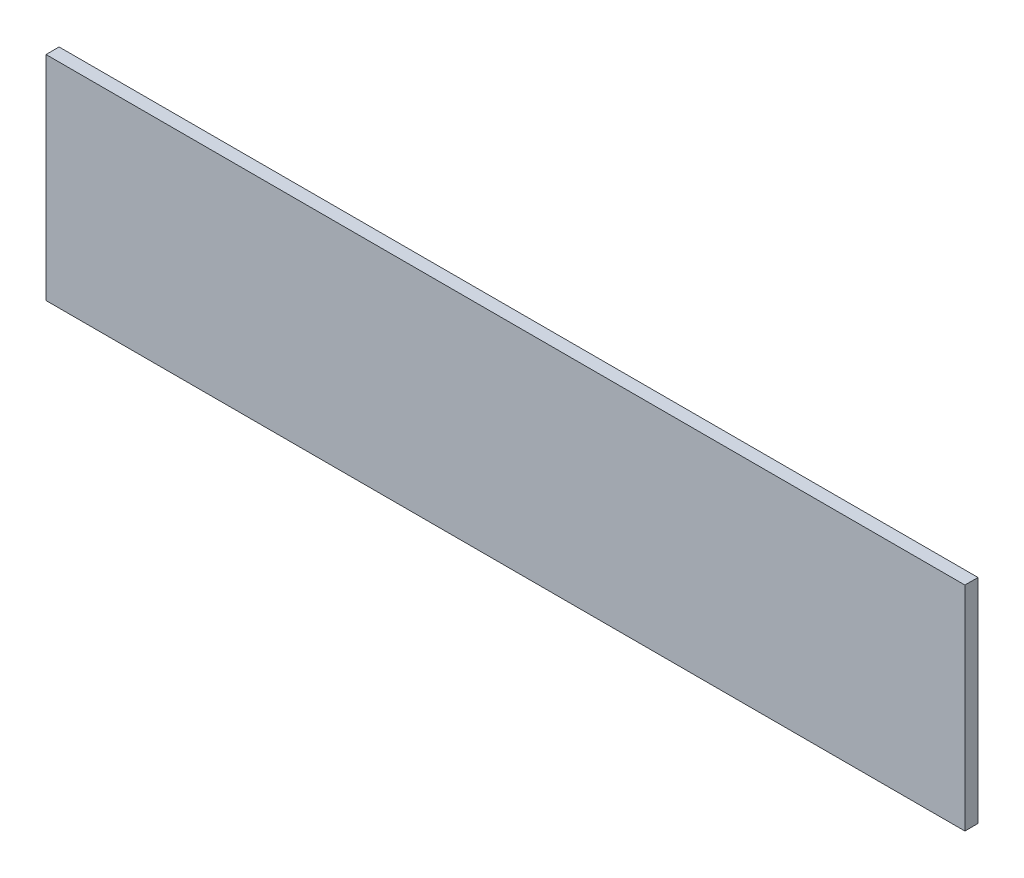
ISO-10303-21;
HEADER;
FILE_DESCRIPTION(('STEP AP214'),'2;1');
FILE_NAME('part.step','',(''),(''),'','','');
FILE_SCHEMA(('AUTOMOTIVE_DESIGN { 1 0 10303 214 1 1 1 1 }'));
ENDSEC;
DATA;
#1=APPLICATION_CONTEXT('core data for automotive mechanical design processes');
#2=APPLICATION_PROTOCOL_DEFINITION('international standard','automotive_design',2000,#1);
#3=PRODUCT_CONTEXT('',#1,'mechanical');
#4=PRODUCT('Part','Part','',(#3));
#5=PRODUCT_RELATED_PRODUCT_CATEGORY('part','',(#4));
#6=PRODUCT_DEFINITION_FORMATION('','',#4);
#7=PRODUCT_DEFINITION_CONTEXT('part definition',#1,'design');
#8=PRODUCT_DEFINITION('design','',#6,#7);
#9=PRODUCT_DEFINITION_SHAPE('','',#8);
#10=(LENGTH_UNIT() NAMED_UNIT(*) SI_UNIT(.MILLI.,.METRE.));
#11=(NAMED_UNIT(*) PLANE_ANGLE_UNIT() SI_UNIT($,.RADIAN.));
#12=(NAMED_UNIT(*) SI_UNIT($,.STERADIAN.) SOLID_ANGLE_UNIT());
#13=UNCERTAINTY_MEASURE_WITH_UNIT(LENGTH_MEASURE(1.E-05),#10,'distance_accuracy_value','');
#14=(GEOMETRIC_REPRESENTATION_CONTEXT(3) GLOBAL_UNCERTAINTY_ASSIGNED_CONTEXT((#13)) GLOBAL_UNIT_ASSIGNED_CONTEXT((#10,
#11,#12)) REPRESENTATION_CONTEXT('',''));
#15=CARTESIAN_POINT('',(0.,0.,0.));
#16=DIRECTION('',(0.,0.,1.));
#17=DIRECTION('',(1.,0.,0.));
#18=AXIS2_PLACEMENT_3D('',#15,#16,#17);
#19=CARTESIAN_POINT('',(-227.6475,72.469375,3.1242));
#20=DIRECTION('',(1.,0.,0.));
#21=DIRECTION('',(0.,0.,-1.));
#22=AXIS2_PLACEMENT_3D('',#19,#20,#21);
#23=PLANE('',#22);
#24=DIRECTION('',(0.,-1.,0.));
#25=VECTOR('',#24,1.);
#26=CARTESIAN_POINT('',(-227.6475,72.469375,0.));
#27=LINE('',#26,#25);
#28=CARTESIAN_POINT('',(-227.6475,72.469375,0.));
#29=VERTEX_POINT('',#28);
#30=CARTESIAN_POINT('',(-227.6475,21.669375,0.));
#31=VERTEX_POINT('',#30);
#32=EDGE_CURVE('E98',#29,#31,#27,.T.);
#33=ORIENTED_EDGE('',*,*,#32,.T.);
#34=DIRECTION('',(0.,0.,-1.));
#35=VECTOR('',#34,1.);
#36=CARTESIAN_POINT('',(-227.6475,21.669375,3.1242));
#37=LINE('',#36,#35);
#38=CARTESIAN_POINT('',(-227.6475,21.669375,3.1242));
#39=VERTEX_POINT('',#38);
#40=EDGE_CURVE('E11',#39,#31,#37,.T.);
#41=ORIENTED_EDGE('',*,*,#40,.F.);
#42=DIRECTION('',(0.,-1.,0.));
#43=VECTOR('',#42,1.);
#44=CARTESIAN_POINT('',(-227.6475,72.469375,3.1242));
#45=LINE('',#44,#43);
#46=CARTESIAN_POINT('',(-227.6475,72.469375,3.1242));
#47=VERTEX_POINT('',#46);
#48=EDGE_CURVE('E86',#47,#39,#45,.T.);
#49=ORIENTED_EDGE('',*,*,#48,.F.);
#50=DIRECTION('',(0.,0.,-1.));
#51=VECTOR('',#50,1.);
#52=CARTESIAN_POINT('',(-227.6475,72.469375,3.1242));
#53=LINE('',#52,#51);
#54=EDGE_CURVE('E94',#47,#29,#53,.T.);
#55=ORIENTED_EDGE('',*,*,#54,.T.);
#56=EDGE_LOOP('',(#33,#41,#49,#55));
#57=FACE_BOUND('',#56,.T.);
#58=ADVANCED_FACE('F35',(#57),#23,.F.);
#59=CARTESIAN_POINT('',(-227.6475,21.669375,3.1242));
#60=DIRECTION('',(0.,1.,0.));
#61=DIRECTION('',(0.,0.,1.));
#62=AXIS2_PLACEMENT_3D('',#59,#60,#61);
#63=PLANE('',#62);
#64=DIRECTION('',(1.,0.,0.));
#65=VECTOR('',#64,1.);
#66=CARTESIAN_POINT('',(-227.6475,21.669375,0.));
#67=LINE('',#66,#65);
#68=CARTESIAN_POINT('',(-8.57249999999987,21.669375,0.));
#69=VERTEX_POINT('',#68);
#70=EDGE_CURVE('E90',#31,#69,#67,.T.);
#71=ORIENTED_EDGE('',*,*,#70,.T.);
#72=DIRECTION('',(0.,0.,-1.));
#73=VECTOR('',#72,1.);
#74=CARTESIAN_POINT('',(-8.57249999999987,21.669375,3.1242));
#75=LINE('',#74,#73);
#76=CARTESIAN_POINT('',(-8.57249999999987,21.669375,3.1242));
#77=VERTEX_POINT('',#76);
#78=EDGE_CURVE('E43',#77,#69,#75,.T.);
#79=ORIENTED_EDGE('',*,*,#78,.F.);
#80=DIRECTION('',(1.,0.,0.));
#81=VECTOR('',#80,1.);
#82=CARTESIAN_POINT('',(-227.6475,21.669375,3.1242));
#83=LINE('',#82,#81);
#84=EDGE_CURVE('E81',#39,#77,#83,.T.);
#85=ORIENTED_EDGE('',*,*,#84,.F.);
#86=ORIENTED_EDGE('',*,*,#40,.T.);
#87=EDGE_LOOP('',(#71,#79,#85,#86));
#88=FACE_BOUND('',#87,.T.);
#89=ADVANCED_FACE('F89',(#88),#63,.F.);
#90=CARTESIAN_POINT('',(-8.57249999999987,72.469375,3.1242));
#91=DIRECTION('',(-1.,0.,0.));
#92=DIRECTION('',(0.,0.,1.));
#93=AXIS2_PLACEMENT_3D('',#90,#91,#92);
#94=PLANE('',#93);
#95=DIRECTION('',(0.,1.,0.));
#96=VECTOR('',#95,1.);
#97=CARTESIAN_POINT('',(-8.57249999999987,72.469375,0.));
#98=LINE('',#97,#96);
#99=CARTESIAN_POINT('',(-8.57249999999987,72.469375,0.));
#100=VERTEX_POINT('',#99);
#101=EDGE_CURVE('E68',#69,#100,#98,.T.);
#102=ORIENTED_EDGE('',*,*,#101,.T.);
#103=DIRECTION('',(0.,0.,-1.));
#104=VECTOR('',#103,1.);
#105=CARTESIAN_POINT('',(-8.57249999999987,72.469375,3.1242));
#106=LINE('',#105,#104);
#107=CARTESIAN_POINT('',(-8.57249999999987,72.469375,3.1242));
#108=VERTEX_POINT('',#107);
#109=EDGE_CURVE('E91',#108,#100,#106,.T.);
#110=ORIENTED_EDGE('',*,*,#109,.F.);
#111=DIRECTION('',(0.,1.,0.));
#112=VECTOR('',#111,1.);
#113=CARTESIAN_POINT('',(-8.57249999999987,72.469375,3.1242));
#114=LINE('',#113,#112);
#115=EDGE_CURVE('E84',#77,#108,#114,.T.);
#116=ORIENTED_EDGE('',*,*,#115,.F.);
#117=ORIENTED_EDGE('',*,*,#78,.T.);
#118=EDGE_LOOP('',(#102,#110,#116,#117));
#119=FACE_BOUND('',#118,.T.);
#120=ADVANCED_FACE('F92',(#119),#94,.F.);
#121=CARTESIAN_POINT('',(-227.6475,72.469375,3.1242));
#122=DIRECTION('',(0.,-1.,0.));
#123=DIRECTION('',(1.,0.,0.));
#124=AXIS2_PLACEMENT_3D('',#121,#122,#123);
#125=PLANE('',#124);
#126=DIRECTION('',(-1.,0.,0.));
#127=VECTOR('',#126,1.);
#128=CARTESIAN_POINT('',(-227.6475,72.469375,0.));
#129=LINE('',#128,#127);
#130=EDGE_CURVE('E74',#100,#29,#129,.T.);
#131=ORIENTED_EDGE('',*,*,#130,.T.);
#132=ORIENTED_EDGE('',*,*,#54,.F.);
#133=DIRECTION('',(-1.,0.,0.));
#134=VECTOR('',#133,1.);
#135=CARTESIAN_POINT('',(-227.6475,72.469375,3.1242));
#136=LINE('',#135,#134);
#137=EDGE_CURVE('E51',#108,#47,#136,.T.);
#138=ORIENTED_EDGE('',*,*,#137,.F.);
#139=ORIENTED_EDGE('',*,*,#109,.T.);
#140=EDGE_LOOP('',(#131,#132,#138,#139));
#141=FACE_BOUND('',#140,.T.);
#142=ADVANCED_FACE('F105',(#141),#125,.F.);
#143=CARTESIAN_POINT('',(0.,0.,3.1242));
#144=DIRECTION('',(0.,0.,1.));
#145=DIRECTION('',(1.,0.,0.));
#146=AXIS2_PLACEMENT_3D('',#143,#144,#145);
#147=PLANE('',#146);
#148=ORIENTED_EDGE('',*,*,#48,.T.);
#149=ORIENTED_EDGE('',*,*,#84,.T.);
#150=ORIENTED_EDGE('',*,*,#115,.T.);
#151=ORIENTED_EDGE('',*,*,#137,.T.);
#152=EDGE_LOOP('',(#148,#149,#150,#151));
#153=FACE_BOUND('',#152,.T.);
#154=ADVANCED_FACE('F82',(#153),#147,.T.);
#155=CARTESIAN_POINT('',(0.,0.,0.));
#156=DIRECTION('',(0.,0.,1.));
#157=DIRECTION('',(1.,0.,0.));
#158=AXIS2_PLACEMENT_3D('',#155,#156,#157);
#159=PLANE('',#158);
#160=ORIENTED_EDGE('',*,*,#32,.F.);
#161=ORIENTED_EDGE('',*,*,#130,.F.);
#162=ORIENTED_EDGE('',*,*,#101,.F.);
#163=ORIENTED_EDGE('',*,*,#70,.F.);
#164=EDGE_LOOP('',(#160,#161,#162,#163));
#165=FACE_BOUND('',#164,.T.);
#166=ADVANCED_FACE('F108',(#165),#159,.F.);
#167=CLOSED_SHELL('',(#58,#89,#120,#142,#154,#166));
#168=MANIFOLD_SOLID_BREP('B2',#167);
#169=ADVANCED_BREP_SHAPE_REPRESENTATION('',(#18,#168),#14);
#170=SHAPE_DEFINITION_REPRESENTATION(#9,#169);
ENDSEC;
END-ISO-10303-21;
